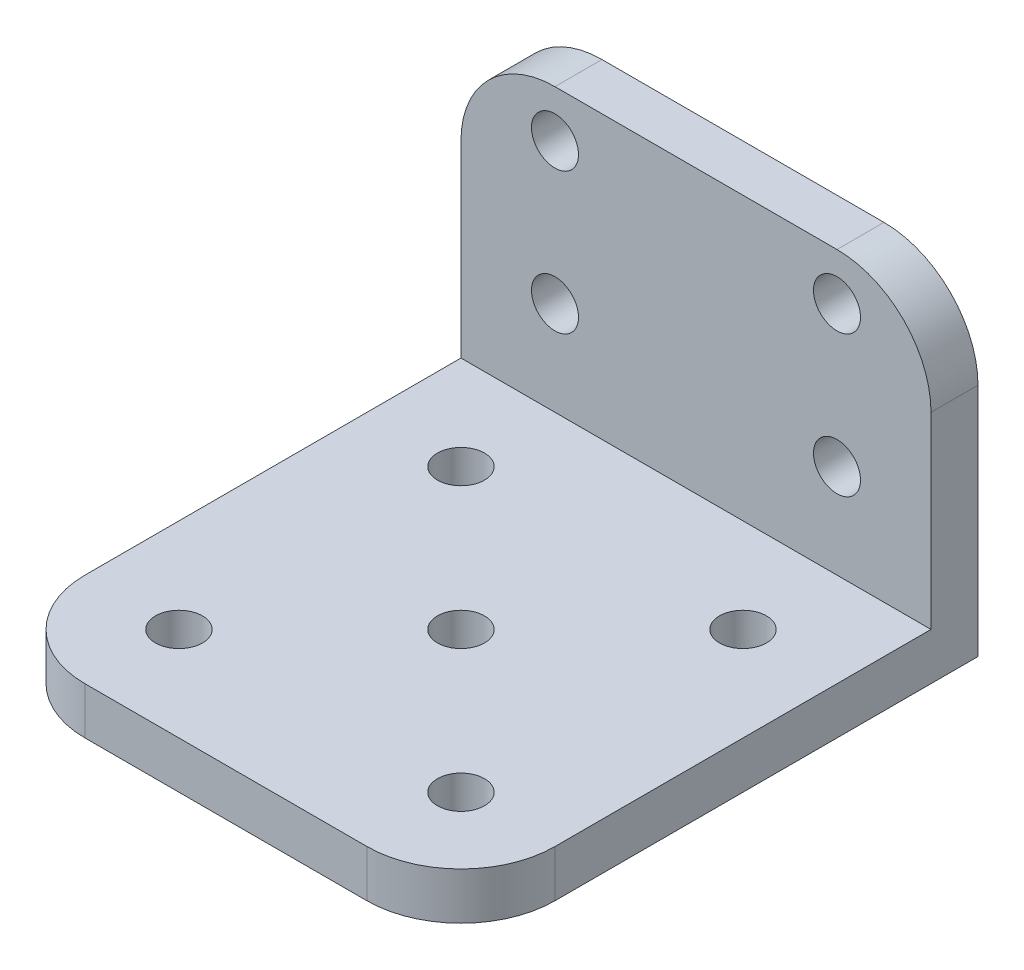
ISO-10303-21;
HEADER;
FILE_DESCRIPTION(('STEP AP214'),'2;1');
FILE_NAME('part.step','',(''),(''),'','','');
FILE_SCHEMA(('AUTOMOTIVE_DESIGN { 1 0 10303 214 1 1 1 1 }'));
ENDSEC;
DATA;
#1=APPLICATION_CONTEXT('core data for automotive mechanical design processes');
#2=APPLICATION_PROTOCOL_DEFINITION('international standard','automotive_design',2000,#1);
#3=PRODUCT_CONTEXT('',#1,'mechanical');
#4=PRODUCT('Part','Part','',(#3));
#5=PRODUCT_RELATED_PRODUCT_CATEGORY('part','',(#4));
#6=PRODUCT_DEFINITION_FORMATION('','',#4);
#7=PRODUCT_DEFINITION_CONTEXT('part definition',#1,'design');
#8=PRODUCT_DEFINITION('design','',#6,#7);
#9=PRODUCT_DEFINITION_SHAPE('','',#8);
#10=(LENGTH_UNIT() NAMED_UNIT(*) SI_UNIT(.MILLI.,.METRE.));
#11=(NAMED_UNIT(*) PLANE_ANGLE_UNIT() SI_UNIT($,.RADIAN.));
#12=(NAMED_UNIT(*) SI_UNIT($,.STERADIAN.) SOLID_ANGLE_UNIT());
#13=UNCERTAINTY_MEASURE_WITH_UNIT(LENGTH_MEASURE(1.E-05),#10,'distance_accuracy_value','');
#14=(GEOMETRIC_REPRESENTATION_CONTEXT(3) GLOBAL_UNCERTAINTY_ASSIGNED_CONTEXT((#13)) GLOBAL_UNIT_ASSIGNED_CONTEXT((#10,
#11,#12)) REPRESENTATION_CONTEXT('',''));
#15=CARTESIAN_POINT('',(0.,0.,0.));
#16=DIRECTION('',(0.,0.,1.));
#17=DIRECTION('',(1.,0.,0.));
#18=AXIS2_PLACEMENT_3D('',#15,#16,#17);
#19=CARTESIAN_POINT('',(0.,0.,5.));
#20=DIRECTION('',(0.,0.,-1.));
#21=DIRECTION('',(-1.,0.,0.));
#22=AXIS2_PLACEMENT_3D('',#19,#20,#21);
#23=PLANE('',#22);
#24=CARTESIAN_POINT('',(40.,29.9999999999998,5.));
#25=DIRECTION('',(0.,0.,1.));
#26=DIRECTION('',(1.,0.,0.));
#27=AXIS2_PLACEMENT_3D('',#24,#25,#26);
#28=CIRCLE('',#27,2.5);
#29=CARTESIAN_POINT('',(42.5,29.9999999999998,5.));
#30=VERTEX_POINT('',#29);
#31=EDGE_CURVE('E173',#30,#30,#28,.T.);
#32=ORIENTED_EDGE('',*,*,#31,.F.);
#33=EDGE_LOOP('',(#32));
#34=FACE_BOUND('',#33,.T.);
#35=CARTESIAN_POINT('',(10.,29.9999999999998,5.));
#36=DIRECTION('',(0.,0.,1.));
#37=DIRECTION('',(1.,0.,0.));
#38=AXIS2_PLACEMENT_3D('',#35,#36,#37);
#39=CIRCLE('',#38,2.5);
#40=CARTESIAN_POINT('',(12.5,29.9999999999998,5.));
#41=VERTEX_POINT('',#40);
#42=EDGE_CURVE('E162',#41,#41,#39,.T.);
#43=ORIENTED_EDGE('',*,*,#42,.F.);
#44=EDGE_LOOP('',(#43));
#45=FACE_BOUND('',#44,.T.);
#46=CARTESIAN_POINT('',(10.,15.,5.));
#47=DIRECTION('',(0.,0.,1.));
#48=DIRECTION('',(1.,0.,0.));
#49=AXIS2_PLACEMENT_3D('',#46,#47,#48);
#50=CIRCLE('',#49,2.5);
#51=CARTESIAN_POINT('',(12.5,15.,5.));
#52=VERTEX_POINT('',#51);
#53=EDGE_CURVE('E182',#52,#52,#50,.T.);
#54=ORIENTED_EDGE('',*,*,#53,.F.);
#55=EDGE_LOOP('',(#54));
#56=FACE_BOUND('',#55,.T.);
#57=CARTESIAN_POINT('',(40.,15.,5.));
#58=DIRECTION('',(0.,0.,1.));
#59=DIRECTION('',(1.,0.,0.));
#60=AXIS2_PLACEMENT_3D('',#57,#58,#59);
#61=CIRCLE('',#60,2.5);
#62=CARTESIAN_POINT('',(42.5,15.,5.));
#63=VERTEX_POINT('',#62);
#64=EDGE_CURVE('E179',#63,#63,#61,.T.);
#65=ORIENTED_EDGE('',*,*,#64,.F.);
#66=EDGE_LOOP('',(#65));
#67=FACE_BOUND('',#66,.T.);
#68=DIRECTION('',(0.,1.,0.));
#69=VECTOR('',#68,1.);
#70=CARTESIAN_POINT('',(50.,0.,5.));
#71=LINE('',#70,#69);
#72=CARTESIAN_POINT('',(50.,5.,5.));
#73=VERTEX_POINT('',#72);
#74=CARTESIAN_POINT('',(50.,25.,5.));
#75=VERTEX_POINT('',#74);
#76=EDGE_CURVE('E118',#73,#75,#71,.T.);
#77=ORIENTED_EDGE('',*,*,#76,.T.);
#78=CARTESIAN_POINT('',(40.,25.,5.));
#79=DIRECTION('',(0.,0.,-1.));
#80=DIRECTION('',(-1.,0.,0.));
#81=AXIS2_PLACEMENT_3D('',#78,#79,#80);
#82=CIRCLE('',#81,10.);
#83=CARTESIAN_POINT('',(40.,35.,5.));
#84=VERTEX_POINT('',#83);
#85=EDGE_CURVE('E43',#75,#84,#82,.F.);
#86=ORIENTED_EDGE('',*,*,#85,.T.);
#87=DIRECTION('',(1.,0.,0.));
#88=VECTOR('',#87,1.);
#89=CARTESIAN_POINT('',(0.,35.,5.));
#90=LINE('',#89,#88);
#91=CARTESIAN_POINT('',(10.,35.,5.));
#92=VERTEX_POINT('',#91);
#93=EDGE_CURVE('E161',#92,#84,#90,.T.);
#94=ORIENTED_EDGE('',*,*,#93,.F.);
#95=CARTESIAN_POINT('',(10.,25.,5.));
#96=DIRECTION('',(0.,0.,-1.));
#97=DIRECTION('',(-1.,0.,0.));
#98=AXIS2_PLACEMENT_3D('',#95,#96,#97);
#99=CIRCLE('',#98,10.);
#100=CARTESIAN_POINT('',(0.,25.,5.));
#101=VERTEX_POINT('',#100);
#102=EDGE_CURVE('E51',#92,#101,#99,.F.);
#103=ORIENTED_EDGE('',*,*,#102,.T.);
#104=DIRECTION('',(0.,-1.,0.));
#105=VECTOR('',#104,1.);
#106=CARTESIAN_POINT('',(0.,0.,5.));
#107=LINE('',#106,#105);
#108=CARTESIAN_POINT('',(0.,5.,5.));
#109=VERTEX_POINT('',#108);
#110=EDGE_CURVE('E112',#101,#109,#107,.T.);
#111=ORIENTED_EDGE('',*,*,#110,.T.);
#112=DIRECTION('',(-1.,0.,0.));
#113=VECTOR('',#112,1.);
#114=CARTESIAN_POINT('',(0.,5.,5.));
#115=LINE('',#114,#113);
#116=EDGE_CURVE('E115',#73,#109,#115,.T.);
#117=ORIENTED_EDGE('',*,*,#116,.F.);
#118=EDGE_LOOP('',(#77,#86,#94,#103,#111,#117));
#119=FACE_BOUND('',#118,.T.);
#120=ADVANCED_FACE('F34',(#34,#45,#56,#67,#119),#23,.F.);
#121=CARTESIAN_POINT('',(0.,0.,5.));
#122=DIRECTION('',(1.,0.,0.));
#123=DIRECTION('',(0.,0.,-1.));
#124=AXIS2_PLACEMENT_3D('',#121,#122,#123);
#125=PLANE('',#124);
#126=ORIENTED_EDGE('',*,*,#110,.F.);
#127=DIRECTION('',(0.,0.,1.));
#128=VECTOR('',#127,1.);
#129=CARTESIAN_POINT('',(0.,25.,0.));
#130=LINE('',#129,#128);
#131=CARTESIAN_POINT('',(0.,25.,0.));
#132=VERTEX_POINT('',#131);
#133=EDGE_CURVE('E11',#101,#132,#130,.F.);
#134=ORIENTED_EDGE('',*,*,#133,.T.);
#135=DIRECTION('',(0.,-1.,0.));
#136=VECTOR('',#135,1.);
#137=CARTESIAN_POINT('',(0.,0.,0.));
#138=LINE('',#137,#136);
#139=CARTESIAN_POINT('',(0.,0.,0.));
#140=VERTEX_POINT('',#139);
#141=EDGE_CURVE('E297',#132,#140,#138,.T.);
#142=ORIENTED_EDGE('',*,*,#141,.T.);
#143=DIRECTION('',(0.,0.,-1.));
#144=VECTOR('',#143,1.);
#145=CARTESIAN_POINT('',(0.,0.,5.));
#146=LINE('',#145,#144);
#147=CARTESIAN_POINT('',(0.,0.,45.));
#148=VERTEX_POINT('',#147);
#149=EDGE_CURVE('E300',#148,#140,#146,.T.);
#150=ORIENTED_EDGE('',*,*,#149,.F.);
#151=DIRECTION('',(0.,-1.,0.));
#152=VECTOR('',#151,1.);
#153=CARTESIAN_POINT('',(0.,0.,45.));
#154=LINE('',#153,#152);
#155=CARTESIAN_POINT('',(0.,5.,45.));
#156=VERTEX_POINT('',#155);
#157=EDGE_CURVE('E126',#148,#156,#154,.F.);
#158=ORIENTED_EDGE('',*,*,#157,.T.);
#159=DIRECTION('',(0.,0.,-1.));
#160=VECTOR('',#159,1.);
#161=CARTESIAN_POINT('',(0.,5.,55.));
#162=LINE('',#161,#160);
#163=EDGE_CURVE('E122',#156,#109,#162,.T.);
#164=ORIENTED_EDGE('',*,*,#163,.T.);
#165=EDGE_LOOP('',(#126,#134,#142,#150,#158,#164));
#166=FACE_BOUND('',#165,.T.);
#167=ADVANCED_FACE('F123',(#166),#125,.F.);
#168=CARTESIAN_POINT('',(50.,0.,5.));
#169=DIRECTION('',(-1.,0.,0.));
#170=DIRECTION('',(0.,0.,1.));
#171=AXIS2_PLACEMENT_3D('',#168,#169,#170);
#172=PLANE('',#171);
#173=DIRECTION('',(0.,1.,0.));
#174=VECTOR('',#173,1.);
#175=CARTESIAN_POINT('',(50.,0.,0.));
#176=LINE('',#175,#174);
#177=CARTESIAN_POINT('',(50.,0.,0.));
#178=VERTEX_POINT('',#177);
#179=CARTESIAN_POINT('',(50.,25.,0.));
#180=VERTEX_POINT('',#179);
#181=EDGE_CURVE('E119',#178,#180,#176,.T.);
#182=ORIENTED_EDGE('',*,*,#181,.T.);
#183=DIRECTION('',(0.,0.,-1.));
#184=VECTOR('',#183,1.);
#185=CARTESIAN_POINT('',(50.,25.,5.));
#186=LINE('',#185,#184);
#187=EDGE_CURVE('E59',#180,#75,#186,.F.);
#188=ORIENTED_EDGE('',*,*,#187,.T.);
#189=ORIENTED_EDGE('',*,*,#76,.F.);
#190=DIRECTION('',(0.,0.,-1.));
#191=VECTOR('',#190,1.);
#192=CARTESIAN_POINT('',(50.,5.,55.));
#193=LINE('',#192,#191);
#194=CARTESIAN_POINT('',(50.,5.,45.));
#195=VERTEX_POINT('',#194);
#196=EDGE_CURVE('E129',#195,#73,#193,.T.);
#197=ORIENTED_EDGE('',*,*,#196,.F.);
#198=DIRECTION('',(0.,1.,0.));
#199=VECTOR('',#198,1.);
#200=CARTESIAN_POINT('',(50.,0.,45.));
#201=LINE('',#200,#199);
#202=CARTESIAN_POINT('',(50.,0.,45.));
#203=VERTEX_POINT('',#202);
#204=EDGE_CURVE('E302',#195,#203,#201,.F.);
#205=ORIENTED_EDGE('',*,*,#204,.T.);
#206=DIRECTION('',(0.,0.,-1.));
#207=VECTOR('',#206,1.);
#208=CARTESIAN_POINT('',(50.,0.,5.));
#209=LINE('',#208,#207);
#210=EDGE_CURVE('E293',#203,#178,#209,.T.);
#211=ORIENTED_EDGE('',*,*,#210,.T.);
#212=EDGE_LOOP('',(#182,#188,#189,#197,#205,#211));
#213=FACE_BOUND('',#212,.T.);
#214=ADVANCED_FACE('F241',(#213),#172,.F.);
#215=CARTESIAN_POINT('',(0.,0.,0.));
#216=DIRECTION('',(0.,0.,-1.));
#217=DIRECTION('',(-1.,0.,0.));
#218=AXIS2_PLACEMENT_3D('',#215,#216,#217);
#219=PLANE('',#218);
#220=CARTESIAN_POINT('',(40.,29.9999999999998,0.));
#221=DIRECTION('',(0.,0.,-1.));
#222=DIRECTION('',(-1.,0.,0.));
#223=AXIS2_PLACEMENT_3D('',#220,#221,#222);
#224=CIRCLE('',#223,2.5);
#225=CARTESIAN_POINT('',(37.5,29.9999999999998,0.));
#226=VERTEX_POINT('',#225);
#227=EDGE_CURVE('E38',#226,#226,#224,.T.);
#228=ORIENTED_EDGE('',*,*,#227,.F.);
#229=EDGE_LOOP('',(#228));
#230=FACE_BOUND('',#229,.T.);
#231=CARTESIAN_POINT('',(10.,29.9999999999998,0.));
#232=DIRECTION('',(0.,0.,-1.));
#233=DIRECTION('',(-1.,0.,0.));
#234=AXIS2_PLACEMENT_3D('',#231,#232,#233);
#235=CIRCLE('',#234,2.5);
#236=CARTESIAN_POINT('',(7.50000000000001,29.9999999999998,0.));
#237=VERTEX_POINT('',#236);
#238=EDGE_CURVE('E159',#237,#237,#235,.T.);
#239=ORIENTED_EDGE('',*,*,#238,.F.);
#240=EDGE_LOOP('',(#239));
#241=FACE_BOUND('',#240,.T.);
#242=CARTESIAN_POINT('',(10.,15.,0.));
#243=DIRECTION('',(0.,0.,1.));
#244=DIRECTION('',(1.,0.,0.));
#245=AXIS2_PLACEMENT_3D('',#242,#243,#244);
#246=CIRCLE('',#245,2.5);
#247=CARTESIAN_POINT('',(12.5,15.,0.));
#248=VERTEX_POINT('',#247);
#249=EDGE_CURVE('E185',#248,#248,#246,.T.);
#250=ORIENTED_EDGE('',*,*,#249,.T.);
#251=EDGE_LOOP('',(#250));
#252=FACE_BOUND('',#251,.T.);
#253=CARTESIAN_POINT('',(40.,15.,0.));
#254=DIRECTION('',(0.,0.,1.));
#255=DIRECTION('',(1.,0.,0.));
#256=AXIS2_PLACEMENT_3D('',#253,#254,#255);
#257=CIRCLE('',#256,2.5);
#258=CARTESIAN_POINT('',(42.5,15.,0.));
#259=VERTEX_POINT('',#258);
#260=EDGE_CURVE('E178',#259,#259,#257,.T.);
#261=ORIENTED_EDGE('',*,*,#260,.T.);
#262=EDGE_LOOP('',(#261));
#263=FACE_BOUND('',#262,.T.);
#264=DIRECTION('',(-1.,0.,0.));
#265=VECTOR('',#264,1.);
#266=CARTESIAN_POINT('',(0.,35.,0.));
#267=LINE('',#266,#265);
#268=CARTESIAN_POINT('',(40.,35.,0.));
#269=VERTEX_POINT('',#268);
#270=CARTESIAN_POINT('',(10.,35.,0.));
#271=VERTEX_POINT('',#270);
#272=EDGE_CURVE('E166',#269,#271,#267,.T.);
#273=ORIENTED_EDGE('',*,*,#272,.F.);
#274=CARTESIAN_POINT('',(40.,25.,0.));
#275=DIRECTION('',(0.,0.,-1.));
#276=DIRECTION('',(-1.,0.,0.));
#277=AXIS2_PLACEMENT_3D('',#274,#275,#276);
#278=CIRCLE('',#277,10.);
#279=EDGE_CURVE('E288',#269,#180,#278,.T.);
#280=ORIENTED_EDGE('',*,*,#279,.T.);
#281=ORIENTED_EDGE('',*,*,#181,.F.);
#282=DIRECTION('',(1.,0.,0.));
#283=VECTOR('',#282,1.);
#284=CARTESIAN_POINT('',(0.,0.,0.));
#285=LINE('',#284,#283);
#286=EDGE_CURVE('E295',#140,#178,#285,.T.);
#287=ORIENTED_EDGE('',*,*,#286,.F.);
#288=ORIENTED_EDGE('',*,*,#141,.F.);
#289=CARTESIAN_POINT('',(10.,25.,0.));
#290=DIRECTION('',(0.,0.,-1.));
#291=DIRECTION('',(-1.,0.,0.));
#292=AXIS2_PLACEMENT_3D('',#289,#290,#291);
#293=CIRCLE('',#292,10.);
#294=EDGE_CURVE('E282',#132,#271,#293,.T.);
#295=ORIENTED_EDGE('',*,*,#294,.T.);
#296=EDGE_LOOP('',(#273,#280,#281,#287,#288,#295));
#297=FACE_BOUND('',#296,.T.);
#298=ADVANCED_FACE('F230',(#230,#241,#252,#263,#297),#219,.T.);
#299=CARTESIAN_POINT('',(0.,0.,5.));
#300=DIRECTION('',(0.,1.,0.));
#301=DIRECTION('',(0.,0.,1.));
#302=AXIS2_PLACEMENT_3D('',#299,#300,#301);
#303=PLANE('',#302);
#304=CARTESIAN_POINT('',(10.,0.,45.));
#305=DIRECTION('',(0.,1.,0.));
#306=DIRECTION('',(0.,0.,1.));
#307=AXIS2_PLACEMENT_3D('',#304,#305,#306);
#308=CIRCLE('',#307,2.5);
#309=CARTESIAN_POINT('',(10.,0.,47.5));
#310=VERTEX_POINT('',#309);
#311=EDGE_CURVE('E191',#310,#310,#308,.T.);
#312=ORIENTED_EDGE('',*,*,#311,.T.);
#313=EDGE_LOOP('',(#312));
#314=FACE_BOUND('',#313,.T.);
#315=CARTESIAN_POINT('',(40.,0.,45.));
#316=DIRECTION('',(0.,1.,0.));
#317=DIRECTION('',(0.,0.,1.));
#318=AXIS2_PLACEMENT_3D('',#315,#316,#317);
#319=CIRCLE('',#318,2.5);
#320=CARTESIAN_POINT('',(40.,0.,47.5));
#321=VERTEX_POINT('',#320);
#322=EDGE_CURVE('E197',#321,#321,#319,.T.);
#323=ORIENTED_EDGE('',*,*,#322,.T.);
#324=EDGE_LOOP('',(#323));
#325=FACE_BOUND('',#324,.T.);
#326=CARTESIAN_POINT('',(40.,0.,15.));
#327=DIRECTION('',(0.,1.,0.));
#328=DIRECTION('',(0.,0.,1.));
#329=AXIS2_PLACEMENT_3D('',#326,#327,#328);
#330=CIRCLE('',#329,2.5);
#331=CARTESIAN_POINT('',(40.,0.,17.5));
#332=VERTEX_POINT('',#331);
#333=EDGE_CURVE('E203',#332,#332,#330,.T.);
#334=ORIENTED_EDGE('',*,*,#333,.T.);
#335=EDGE_LOOP('',(#334));
#336=FACE_BOUND('',#335,.T.);
#337=CARTESIAN_POINT('',(25.,0.,30.));
#338=DIRECTION('',(0.,1.,0.));
#339=DIRECTION('',(0.,0.,1.));
#340=AXIS2_PLACEMENT_3D('',#337,#338,#339);
#341=CIRCLE('',#340,2.5);
#342=CARTESIAN_POINT('',(25.,0.,32.5));
#343=VERTEX_POINT('',#342);
#344=EDGE_CURVE('E209',#343,#343,#341,.T.);
#345=ORIENTED_EDGE('',*,*,#344,.T.);
#346=EDGE_LOOP('',(#345));
#347=FACE_BOUND('',#346,.T.);
#348=CARTESIAN_POINT('',(10.,0.,15.));
#349=DIRECTION('',(0.,1.,0.));
#350=DIRECTION('',(0.,0.,1.));
#351=AXIS2_PLACEMENT_3D('',#348,#349,#350);
#352=CIRCLE('',#351,2.5);
#353=CARTESIAN_POINT('',(10.,0.,17.5));
#354=VERTEX_POINT('',#353);
#355=EDGE_CURVE('E135',#354,#354,#352,.T.);
#356=ORIENTED_EDGE('',*,*,#355,.T.);
#357=EDGE_LOOP('',(#356));
#358=FACE_BOUND('',#357,.T.);
#359=DIRECTION('',(1.,0.,0.));
#360=VECTOR('',#359,1.);
#361=CARTESIAN_POINT('',(0.,0.,55.));
#362=LINE('',#361,#360);
#363=CARTESIAN_POINT('',(10.,0.,55.));
#364=VERTEX_POINT('',#363);
#365=CARTESIAN_POINT('',(40.,0.,55.));
#366=VERTEX_POINT('',#365);
#367=EDGE_CURVE('E134',#364,#366,#362,.T.);
#368=ORIENTED_EDGE('',*,*,#367,.F.);
#369=CARTESIAN_POINT('',(10.,0.,45.));
#370=DIRECTION('',(0.,1.,0.));
#371=DIRECTION('',(0.,0.,1.));
#372=AXIS2_PLACEMENT_3D('',#369,#370,#371);
#373=CIRCLE('',#372,10.);
#374=EDGE_CURVE('E317',#364,#148,#373,.F.);
#375=ORIENTED_EDGE('',*,*,#374,.T.);
#376=ORIENTED_EDGE('',*,*,#149,.T.);
#377=ORIENTED_EDGE('',*,*,#286,.T.);
#378=ORIENTED_EDGE('',*,*,#210,.F.);
#379=CARTESIAN_POINT('',(40.,0.,45.));
#380=DIRECTION('',(0.,1.,0.));
#381=DIRECTION('',(0.,0.,1.));
#382=AXIS2_PLACEMENT_3D('',#379,#380,#381);
#383=CIRCLE('',#382,10.);
#384=EDGE_CURVE('E315',#203,#366,#383,.F.);
#385=ORIENTED_EDGE('',*,*,#384,.T.);
#386=EDGE_LOOP('',(#368,#375,#376,#377,#378,#385));
#387=FACE_BOUND('',#386,.T.);
#388=ADVANCED_FACE('F221',(#314,#325,#336,#347,#358,#387),#303,.F.);
#389=CARTESIAN_POINT('',(0.,5.,55.));
#390=DIRECTION('',(0.,-1.,0.));
#391=DIRECTION('',(0.,0.,-1.));
#392=AXIS2_PLACEMENT_3D('',#389,#390,#391);
#393=PLANE('',#392);
#394=CARTESIAN_POINT('',(10.,5.,45.));
#395=DIRECTION('',(0.,1.,0.));
#396=DIRECTION('',(0.,0.,1.));
#397=AXIS2_PLACEMENT_3D('',#394,#395,#396);
#398=CIRCLE('',#397,2.5);
#399=CARTESIAN_POINT('',(10.,5.,47.5));
#400=VERTEX_POINT('',#399);
#401=EDGE_CURVE('E188',#400,#400,#398,.T.);
#402=ORIENTED_EDGE('',*,*,#401,.F.);
#403=EDGE_LOOP('',(#402));
#404=FACE_BOUND('',#403,.T.);
#405=CARTESIAN_POINT('',(40.,5.,45.));
#406=DIRECTION('',(0.,1.,0.));
#407=DIRECTION('',(0.,0.,1.));
#408=AXIS2_PLACEMENT_3D('',#405,#406,#407);
#409=CIRCLE('',#408,2.5);
#410=CARTESIAN_POINT('',(40.,5.,47.5));
#411=VERTEX_POINT('',#410);
#412=EDGE_CURVE('E194',#411,#411,#409,.T.);
#413=ORIENTED_EDGE('',*,*,#412,.F.);
#414=EDGE_LOOP('',(#413));
#415=FACE_BOUND('',#414,.T.);
#416=CARTESIAN_POINT('',(40.,5.,15.));
#417=DIRECTION('',(0.,1.,0.));
#418=DIRECTION('',(0.,0.,1.));
#419=AXIS2_PLACEMENT_3D('',#416,#417,#418);
#420=CIRCLE('',#419,2.5);
#421=CARTESIAN_POINT('',(40.,5.,17.5));
#422=VERTEX_POINT('',#421);
#423=EDGE_CURVE('E200',#422,#422,#420,.T.);
#424=ORIENTED_EDGE('',*,*,#423,.F.);
#425=EDGE_LOOP('',(#424));
#426=FACE_BOUND('',#425,.T.);
#427=CARTESIAN_POINT('',(25.,5.,30.));
#428=DIRECTION('',(0.,1.,0.));
#429=DIRECTION('',(0.,0.,1.));
#430=AXIS2_PLACEMENT_3D('',#427,#428,#429);
#431=CIRCLE('',#430,2.5);
#432=CARTESIAN_POINT('',(25.,5.,32.5));
#433=VERTEX_POINT('',#432);
#434=EDGE_CURVE('E206',#433,#433,#431,.T.);
#435=ORIENTED_EDGE('',*,*,#434,.F.);
#436=EDGE_LOOP('',(#435));
#437=FACE_BOUND('',#436,.T.);
#438=CARTESIAN_POINT('',(10.,5.,15.));
#439=DIRECTION('',(0.,1.,0.));
#440=DIRECTION('',(0.,0.,1.));
#441=AXIS2_PLACEMENT_3D('',#438,#439,#440);
#442=CIRCLE('',#441,2.5);
#443=CARTESIAN_POINT('',(10.,5.,17.5));
#444=VERTEX_POINT('',#443);
#445=EDGE_CURVE('E140',#444,#444,#442,.T.);
#446=ORIENTED_EDGE('',*,*,#445,.F.);
#447=EDGE_LOOP('',(#446));
#448=FACE_BOUND('',#447,.T.);
#449=ORIENTED_EDGE('',*,*,#163,.F.);
#450=CARTESIAN_POINT('',(10.,5.,45.));
#451=DIRECTION('',(0.,-1.,0.));
#452=DIRECTION('',(0.,0.,-1.));
#453=AXIS2_PLACEMENT_3D('',#450,#451,#452);
#454=CIRCLE('',#453,10.);
#455=CARTESIAN_POINT('',(10.,5.,55.));
#456=VERTEX_POINT('',#455);
#457=EDGE_CURVE('E280',#156,#456,#454,.F.);
#458=ORIENTED_EDGE('',*,*,#457,.T.);
#459=DIRECTION('',(-1.,0.,0.));
#460=VECTOR('',#459,1.);
#461=CARTESIAN_POINT('',(0.,5.,55.));
#462=LINE('',#461,#460);
#463=CARTESIAN_POINT('',(40.,5.,55.));
#464=VERTEX_POINT('',#463);
#465=EDGE_CURVE('E130',#464,#456,#462,.T.);
#466=ORIENTED_EDGE('',*,*,#465,.F.);
#467=CARTESIAN_POINT('',(40.,5.,45.));
#468=DIRECTION('',(0.,-1.,0.));
#469=DIRECTION('',(0.,0.,-1.));
#470=AXIS2_PLACEMENT_3D('',#467,#468,#469);
#471=CIRCLE('',#470,10.);
#472=EDGE_CURVE('E284',#464,#195,#471,.F.);
#473=ORIENTED_EDGE('',*,*,#472,.T.);
#474=ORIENTED_EDGE('',*,*,#196,.T.);
#475=ORIENTED_EDGE('',*,*,#116,.T.);
#476=EDGE_LOOP('',(#449,#458,#466,#473,#474,#475));
#477=FACE_BOUND('',#476,.T.);
#478=ADVANCED_FACE('F132',(#404,#415,#426,#437,#448,#477),#393,.F.);
#479=CARTESIAN_POINT('',(0.,0.,55.));
#480=DIRECTION('',(0.,0.,-1.));
#481=DIRECTION('',(-1.,0.,0.));
#482=AXIS2_PLACEMENT_3D('',#479,#480,#481);
#483=PLANE('',#482);
#484=ORIENTED_EDGE('',*,*,#465,.T.);
#485=DIRECTION('',(0.,-1.,0.));
#486=VECTOR('',#485,1.);
#487=CARTESIAN_POINT('',(10.,0.,55.));
#488=LINE('',#487,#486);
#489=EDGE_CURVE('E312',#456,#364,#488,.T.);
#490=ORIENTED_EDGE('',*,*,#489,.T.);
#491=ORIENTED_EDGE('',*,*,#367,.T.);
#492=DIRECTION('',(0.,1.,0.));
#493=VECTOR('',#492,1.);
#494=CARTESIAN_POINT('',(40.,0.,55.));
#495=LINE('',#494,#493);
#496=EDGE_CURVE('E306',#366,#464,#495,.T.);
#497=ORIENTED_EDGE('',*,*,#496,.T.);
#498=EDGE_LOOP('',(#484,#490,#491,#497));
#499=FACE_BOUND('',#498,.T.);
#500=ADVANCED_FACE('F220',(#499),#483,.F.);
#501=CARTESIAN_POINT('',(10.,0.,15.));
#502=DIRECTION('',(0.,1.,0.));
#503=DIRECTION('',(0.,0.,1.));
#504=AXIS2_PLACEMENT_3D('',#501,#502,#503);
#505=CYLINDRICAL_SURFACE('',#504,2.5);
#506=ORIENTED_EDGE('',*,*,#355,.F.);
#507=EDGE_LOOP('',(#506));
#508=FACE_BOUND('',#507,.T.);
#509=ORIENTED_EDGE('',*,*,#445,.T.);
#510=EDGE_LOOP('',(#509));
#511=FACE_BOUND('',#510,.T.);
#512=ADVANCED_FACE('F217',(#508,#511),#505,.F.);
#513=CARTESIAN_POINT('',(25.,0.,30.));
#514=DIRECTION('',(0.,1.,0.));
#515=DIRECTION('',(0.,0.,1.));
#516=AXIS2_PLACEMENT_3D('',#513,#514,#515);
#517=CYLINDRICAL_SURFACE('',#516,2.5);
#518=ORIENTED_EDGE('',*,*,#344,.F.);
#519=EDGE_LOOP('',(#518));
#520=FACE_BOUND('',#519,.T.);
#521=ORIENTED_EDGE('',*,*,#434,.T.);
#522=EDGE_LOOP('',(#521));
#523=FACE_BOUND('',#522,.T.);
#524=ADVANCED_FACE('F349',(#520,#523),#517,.F.);
#525=CARTESIAN_POINT('',(40.,0.,15.));
#526=DIRECTION('',(0.,1.,0.));
#527=DIRECTION('',(0.,0.,1.));
#528=AXIS2_PLACEMENT_3D('',#525,#526,#527);
#529=CYLINDRICAL_SURFACE('',#528,2.5);
#530=ORIENTED_EDGE('',*,*,#333,.F.);
#531=EDGE_LOOP('',(#530));
#532=FACE_BOUND('',#531,.T.);
#533=ORIENTED_EDGE('',*,*,#423,.T.);
#534=EDGE_LOOP('',(#533));
#535=FACE_BOUND('',#534,.T.);
#536=ADVANCED_FACE('F345',(#532,#535),#529,.F.);
#537=CARTESIAN_POINT('',(40.,0.,45.));
#538=DIRECTION('',(0.,1.,0.));
#539=DIRECTION('',(0.,0.,1.));
#540=AXIS2_PLACEMENT_3D('',#537,#538,#539);
#541=CYLINDRICAL_SURFACE('',#540,2.5);
#542=ORIENTED_EDGE('',*,*,#322,.F.);
#543=EDGE_LOOP('',(#542));
#544=FACE_BOUND('',#543,.T.);
#545=ORIENTED_EDGE('',*,*,#412,.T.);
#546=EDGE_LOOP('',(#545));
#547=FACE_BOUND('',#546,.T.);
#548=ADVANCED_FACE('F341',(#544,#547),#541,.F.);
#549=CARTESIAN_POINT('',(10.,0.,45.));
#550=DIRECTION('',(0.,1.,0.));
#551=DIRECTION('',(0.,0.,1.));
#552=AXIS2_PLACEMENT_3D('',#549,#550,#551);
#553=CYLINDRICAL_SURFACE('',#552,2.5);
#554=ORIENTED_EDGE('',*,*,#311,.F.);
#555=EDGE_LOOP('',(#554));
#556=FACE_BOUND('',#555,.T.);
#557=ORIENTED_EDGE('',*,*,#401,.T.);
#558=EDGE_LOOP('',(#557));
#559=FACE_BOUND('',#558,.T.);
#560=ADVANCED_FACE('F337',(#556,#559),#553,.F.);
#561=CARTESIAN_POINT('',(10.,15.,0.));
#562=DIRECTION('',(0.,0.,1.));
#563=DIRECTION('',(1.,0.,0.));
#564=AXIS2_PLACEMENT_3D('',#561,#562,#563);
#565=CYLINDRICAL_SURFACE('',#564,2.5);
#566=ORIENTED_EDGE('',*,*,#249,.F.);
#567=EDGE_LOOP('',(#566));
#568=FACE_BOUND('',#567,.T.);
#569=ORIENTED_EDGE('',*,*,#53,.T.);
#570=EDGE_LOOP('',(#569));
#571=FACE_BOUND('',#570,.T.);
#572=ADVANCED_FACE('F333',(#568,#571),#565,.F.);
#573=CARTESIAN_POINT('',(40.,15.,0.));
#574=DIRECTION('',(0.,0.,1.));
#575=DIRECTION('',(1.,0.,0.));
#576=AXIS2_PLACEMENT_3D('',#573,#574,#575);
#577=CYLINDRICAL_SURFACE('',#576,2.5);
#578=ORIENTED_EDGE('',*,*,#260,.F.);
#579=EDGE_LOOP('',(#578));
#580=FACE_BOUND('',#579,.T.);
#581=ORIENTED_EDGE('',*,*,#64,.T.);
#582=EDGE_LOOP('',(#581));
#583=FACE_BOUND('',#582,.T.);
#584=ADVANCED_FACE('F255',(#580,#583),#577,.F.);
#585=CARTESIAN_POINT('',(10.,0.,45.));
#586=DIRECTION('',(0.,-1.,0.));
#587=DIRECTION('',(0.,0.,-1.));
#588=AXIS2_PLACEMENT_3D('',#585,#586,#587);
#589=CYLINDRICAL_SURFACE('',#588,10.);
#590=ORIENTED_EDGE('',*,*,#457,.F.);
#591=ORIENTED_EDGE('',*,*,#157,.F.);
#592=ORIENTED_EDGE('',*,*,#374,.F.);
#593=ORIENTED_EDGE('',*,*,#489,.F.);
#594=EDGE_LOOP('',(#590,#591,#592,#593));
#595=FACE_BOUND('',#594,.T.);
#596=ADVANCED_FACE('F251',(#595),#589,.T.);
#597=CARTESIAN_POINT('',(40.,0.,45.));
#598=DIRECTION('',(0.,1.,0.));
#599=DIRECTION('',(0.,0.,1.));
#600=AXIS2_PLACEMENT_3D('',#597,#598,#599);
#601=CYLINDRICAL_SURFACE('',#600,10.);
#602=ORIENTED_EDGE('',*,*,#384,.F.);
#603=ORIENTED_EDGE('',*,*,#204,.F.);
#604=ORIENTED_EDGE('',*,*,#472,.F.);
#605=ORIENTED_EDGE('',*,*,#496,.F.);
#606=EDGE_LOOP('',(#602,#603,#604,#605));
#607=FACE_BOUND('',#606,.T.);
#608=ADVANCED_FACE('F254',(#607),#601,.T.);
#609=CARTESIAN_POINT('',(0.,35.,0.));
#610=DIRECTION('',(0.,1.,0.));
#611=DIRECTION('',(0.,0.,1.));
#612=AXIS2_PLACEMENT_3D('',#609,#610,#611);
#613=PLANE('',#612);
#614=ORIENTED_EDGE('',*,*,#93,.T.);
#615=DIRECTION('',(0.,0.,-1.));
#616=VECTOR('',#615,1.);
#617=CARTESIAN_POINT('',(40.,35.,0.));
#618=LINE('',#617,#616);
#619=EDGE_CURVE('E274',#84,#269,#618,.T.);
#620=ORIENTED_EDGE('',*,*,#619,.T.);
#621=ORIENTED_EDGE('',*,*,#272,.T.);
#622=DIRECTION('',(0.,0.,1.));
#623=VECTOR('',#622,1.);
#624=CARTESIAN_POINT('',(10.,35.,5.));
#625=LINE('',#624,#623);
#626=EDGE_CURVE('E278',#271,#92,#625,.T.);
#627=ORIENTED_EDGE('',*,*,#626,.T.);
#628=EDGE_LOOP('',(#614,#620,#621,#627));
#629=FACE_BOUND('',#628,.T.);
#630=ADVANCED_FACE('F258',(#629),#613,.T.);
#631=CARTESIAN_POINT('',(40.,25.,0.));
#632=DIRECTION('',(0.,0.,1.));
#633=DIRECTION('',(1.,0.,0.));
#634=AXIS2_PLACEMENT_3D('',#631,#632,#633);
#635=CYLINDRICAL_SURFACE('',#634,10.);
#636=ORIENTED_EDGE('',*,*,#85,.F.);
#637=ORIENTED_EDGE('',*,*,#187,.F.);
#638=ORIENTED_EDGE('',*,*,#279,.F.);
#639=ORIENTED_EDGE('',*,*,#619,.F.);
#640=EDGE_LOOP('',(#636,#637,#638,#639));
#641=FACE_BOUND('',#640,.T.);
#642=ADVANCED_FACE('F260',(#641),#635,.T.);
#643=CARTESIAN_POINT('',(10.,25.,0.));
#644=DIRECTION('',(0.,0.,-1.));
#645=DIRECTION('',(-1.,0.,0.));
#646=AXIS2_PLACEMENT_3D('',#643,#644,#645);
#647=CYLINDRICAL_SURFACE('',#646,10.);
#648=ORIENTED_EDGE('',*,*,#294,.F.);
#649=ORIENTED_EDGE('',*,*,#133,.F.);
#650=ORIENTED_EDGE('',*,*,#102,.F.);
#651=ORIENTED_EDGE('',*,*,#626,.F.);
#652=EDGE_LOOP('',(#648,#649,#650,#651));
#653=FACE_BOUND('',#652,.T.);
#654=ADVANCED_FACE('F36',(#653),#647,.T.);
#655=CARTESIAN_POINT('',(10.,29.9999999999998,-15.));
#656=DIRECTION('',(0.,0.,1.));
#657=DIRECTION('',(1.,0.,0.));
#658=AXIS2_PLACEMENT_3D('',#655,#656,#657);
#659=CYLINDRICAL_SURFACE('',#658,2.5);
#660=ORIENTED_EDGE('',*,*,#238,.T.);
#661=EDGE_LOOP('',(#660));
#662=FACE_BOUND('',#661,.T.);
#663=ORIENTED_EDGE('',*,*,#42,.T.);
#664=EDGE_LOOP('',(#663));
#665=FACE_BOUND('',#664,.T.);
#666=ADVANCED_FACE('F267',(#662,#665),#659,.F.);
#667=CARTESIAN_POINT('',(40.,29.9999999999998,-15.));
#668=DIRECTION('',(0.,0.,1.));
#669=DIRECTION('',(1.,0.,0.));
#670=AXIS2_PLACEMENT_3D('',#667,#668,#669);
#671=CYLINDRICAL_SURFACE('',#670,2.5);
#672=ORIENTED_EDGE('',*,*,#227,.T.);
#673=EDGE_LOOP('',(#672));
#674=FACE_BOUND('',#673,.T.);
#675=ORIENTED_EDGE('',*,*,#31,.T.);
#676=EDGE_LOOP('',(#675));
#677=FACE_BOUND('',#676,.T.);
#678=ADVANCED_FACE('F434',(#674,#677),#671,.F.);
#679=CLOSED_SHELL('',(#120,#167,#214,#298,#388,#478,#500,#512,#524,#536,#548,#560,#572,#584,
#596,#608,#630,#642,#654,#666,#678));
#680=MANIFOLD_SOLID_BREP('B2',#679);
#681=ADVANCED_BREP_SHAPE_REPRESENTATION('',(#18,#680),#14);
#682=SHAPE_DEFINITION_REPRESENTATION(#9,#681);
ENDSEC;
END-ISO-10303-21;
